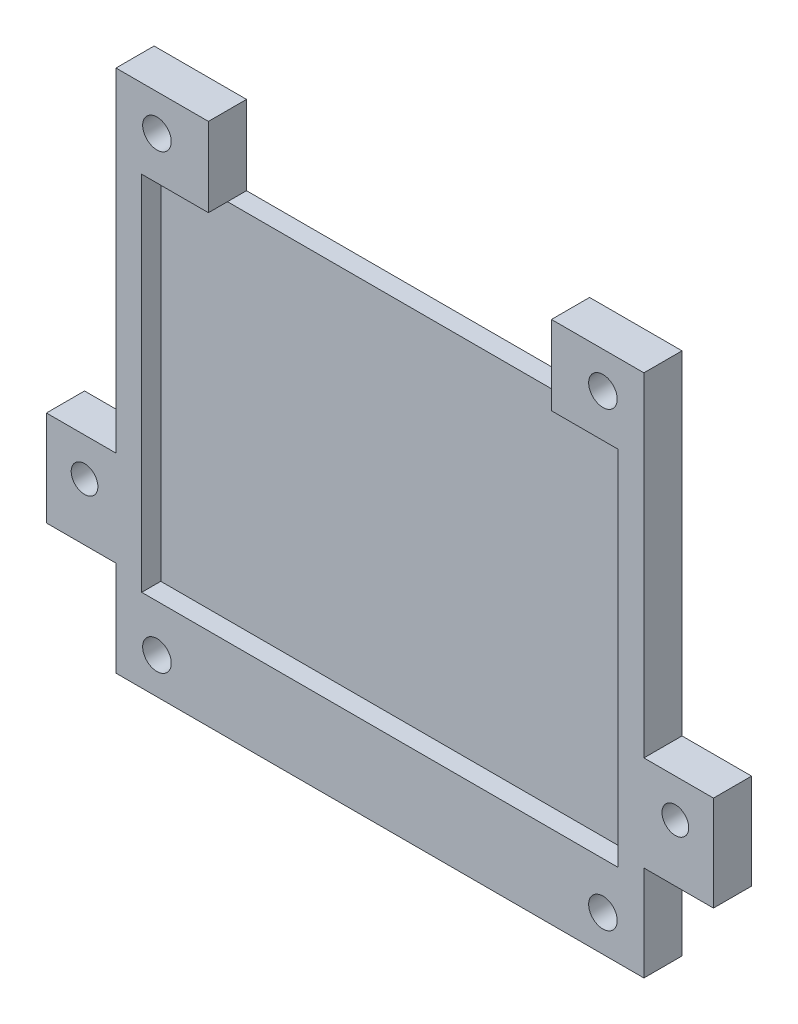
ISO-10303-21;
HEADER;
FILE_DESCRIPTION(('STEP AP214'),'2;1');
FILE_NAME('part.step','',(''),(''),'','','');
FILE_SCHEMA(('AUTOMOTIVE_DESIGN { 1 0 10303 214 1 1 1 1 }'));
ENDSEC;
DATA;
#1=APPLICATION_CONTEXT('core data for automotive mechanical design processes');
#2=APPLICATION_PROTOCOL_DEFINITION('international standard','automotive_design',2000,#1);
#3=PRODUCT_CONTEXT('',#1,'mechanical');
#4=PRODUCT('Part','Part','',(#3));
#5=PRODUCT_RELATED_PRODUCT_CATEGORY('part','',(#4));
#6=PRODUCT_DEFINITION_FORMATION('','',#4);
#7=PRODUCT_DEFINITION_CONTEXT('part definition',#1,'design');
#8=PRODUCT_DEFINITION('design','',#6,#7);
#9=PRODUCT_DEFINITION_SHAPE('','',#8);
#10=(LENGTH_UNIT() NAMED_UNIT(*) SI_UNIT(.MILLI.,.METRE.));
#11=(NAMED_UNIT(*) PLANE_ANGLE_UNIT() SI_UNIT($,.RADIAN.));
#12=(NAMED_UNIT(*) SI_UNIT($,.STERADIAN.) SOLID_ANGLE_UNIT());
#13=UNCERTAINTY_MEASURE_WITH_UNIT(LENGTH_MEASURE(1.E-05),#10,'distance_accuracy_value','');
#14=(GEOMETRIC_REPRESENTATION_CONTEXT(3) GLOBAL_UNCERTAINTY_ASSIGNED_CONTEXT((#13)) GLOBAL_UNIT_ASSIGNED_CONTEXT((#10,
#11,#12)) REPRESENTATION_CONTEXT('',''));
#15=CARTESIAN_POINT('',(0.,0.,0.));
#16=DIRECTION('',(0.,0.,1.));
#17=DIRECTION('',(1.,0.,0.));
#18=AXIS2_PLACEMENT_3D('',#15,#16,#17);
#19=CARTESIAN_POINT('',(13.85,13.75,2.));
#20=DIRECTION('',(1.,0.,0.));
#21=DIRECTION('',(0.,0.,-1.));
#22=AXIS2_PLACEMENT_3D('',#19,#20,#21);
#23=PLANE('',#22);
#24=DIRECTION('',(0.,-1.,0.));
#25=VECTOR('',#24,1.);
#26=CARTESIAN_POINT('',(13.85,13.75,2.));
#27=LINE('',#26,#25);
#28=CARTESIAN_POINT('',(13.85,13.75,2.));
#29=VERTEX_POINT('',#28);
#30=CARTESIAN_POINT('',(13.85,-3.74999999999989,2.));
#31=VERTEX_POINT('',#30);
#32=EDGE_CURVE('E84',#29,#31,#27,.T.);
#33=ORIENTED_EDGE('',*,*,#32,.T.);
#34=DIRECTION('',(0.,0.,-1.));
#35=VECTOR('',#34,1.);
#36=CARTESIAN_POINT('',(13.85,-3.74999999999989,2.));
#37=LINE('',#36,#35);
#38=CARTESIAN_POINT('',(13.85,-3.74999999999989,0.));
#39=VERTEX_POINT('',#38);
#40=EDGE_CURVE('E236',#31,#39,#37,.T.);
#41=ORIENTED_EDGE('',*,*,#40,.T.);
#42=DIRECTION('',(0.,-1.,0.));
#43=VECTOR('',#42,1.);
#44=CARTESIAN_POINT('',(13.85,13.75,0.));
#45=LINE('',#44,#43);
#46=CARTESIAN_POINT('',(13.85,13.75,0.));
#47=VERTEX_POINT('',#46);
#48=EDGE_CURVE('E393',#47,#39,#45,.T.);
#49=ORIENTED_EDGE('',*,*,#48,.F.);
#50=DIRECTION('',(0.,0.,-1.));
#51=VECTOR('',#50,1.);
#52=CARTESIAN_POINT('',(13.85,13.75,2.));
#53=LINE('',#52,#51);
#54=EDGE_CURVE('E401',#29,#47,#53,.T.);
#55=ORIENTED_EDGE('',*,*,#54,.F.);
#56=EDGE_LOOP('',(#33,#41,#49,#55));
#57=FACE_BOUND('',#56,.T.);
#58=ADVANCED_FACE('F69',(#57),#23,.T.);
#59=CARTESIAN_POINT('',(-13.85,13.75,2.));
#60=DIRECTION('',(1.,0.,0.));
#61=DIRECTION('',(0.,0.,-1.));
#62=AXIS2_PLACEMENT_3D('',#59,#60,#61);
#63=PLANE('',#62);
#64=DIRECTION('',(0.,0.,-1.));
#65=VECTOR('',#64,1.);
#66=CARTESIAN_POINT('',(-13.85,-3.75,2.));
#67=LINE('',#66,#65);
#68=CARTESIAN_POINT('',(-13.85,-3.75,2.));
#69=VERTEX_POINT('',#68);
#70=CARTESIAN_POINT('',(-13.85,-3.75,0.));
#71=VERTEX_POINT('',#70);
#72=EDGE_CURVE('E280',#69,#71,#67,.T.);
#73=ORIENTED_EDGE('',*,*,#72,.F.);
#74=DIRECTION('',(0.,-1.,0.));
#75=VECTOR('',#74,1.);
#76=CARTESIAN_POINT('',(-13.85,13.75,2.));
#77=LINE('',#76,#75);
#78=CARTESIAN_POINT('',(-13.85,13.75,2.));
#79=VERTEX_POINT('',#78);
#80=EDGE_CURVE('E373',#79,#69,#77,.T.);
#81=ORIENTED_EDGE('',*,*,#80,.F.);
#82=DIRECTION('',(0.,0.,-1.));
#83=VECTOR('',#82,1.);
#84=CARTESIAN_POINT('',(-13.85,13.75,2.));
#85=LINE('',#84,#83);
#86=CARTESIAN_POINT('',(-13.85,13.75,0.));
#87=VERTEX_POINT('',#86);
#88=EDGE_CURVE('E386',#79,#87,#85,.T.);
#89=ORIENTED_EDGE('',*,*,#88,.T.);
#90=DIRECTION('',(0.,-1.,0.));
#91=VECTOR('',#90,1.);
#92=CARTESIAN_POINT('',(-13.85,13.75,0.));
#93=LINE('',#92,#91);
#94=EDGE_CURVE('E387',#87,#71,#93,.T.);
#95=ORIENTED_EDGE('',*,*,#94,.T.);
#96=EDGE_LOOP('',(#73,#81,#89,#95));
#97=FACE_BOUND('',#96,.T.);
#98=ADVANCED_FACE('F430',(#97),#63,.F.);
#99=CARTESIAN_POINT('',(0.,0.,2.));
#100=DIRECTION('',(0.,0.,1.));
#101=DIRECTION('',(1.,0.,0.));
#102=AXIS2_PLACEMENT_3D('',#99,#100,#101);
#103=PLANE('',#102);
#104=CARTESIAN_POINT('',(13.85,-8.75,2.));
#105=VERTEX_POINT('',#104);
#106=CARTESIAN_POINT('',(13.85,-13.75,2.));
#107=VERTEX_POINT('',#106);
#108=EDGE_CURVE('E380',#105,#107,#27,.T.);
#109=ORIENTED_EDGE('',*,*,#108,.F.);
#110=DIRECTION('',(-1.,0.,0.));
#111=VECTOR('',#110,1.);
#112=CARTESIAN_POINT('',(0.,-8.75,2.));
#113=LINE('',#112,#111);
#114=CARTESIAN_POINT('',(17.5,-8.75,2.));
#115=VERTEX_POINT('',#114);
#116=EDGE_CURVE('E221',#115,#105,#113,.T.);
#117=ORIENTED_EDGE('',*,*,#116,.F.);
#118=DIRECTION('',(0.,1.,0.));
#119=VECTOR('',#118,1.);
#120=CARTESIAN_POINT('',(17.5,0.,2.));
#121=LINE('',#120,#119);
#122=CARTESIAN_POINT('',(17.5,-3.74999999999989,2.));
#123=VERTEX_POINT('',#122);
#124=EDGE_CURVE('E214',#115,#123,#121,.T.);
#125=ORIENTED_EDGE('',*,*,#124,.T.);
#126=DIRECTION('',(-1.,0.,0.));
#127=VECTOR('',#126,1.);
#128=CARTESIAN_POINT('',(0.,-3.74999999999989,2.));
#129=LINE('',#128,#127);
#130=EDGE_CURVE('E219',#123,#31,#129,.T.);
#131=ORIENTED_EDGE('',*,*,#130,.T.);
#132=ORIENTED_EDGE('',*,*,#32,.F.);
#133=DIRECTION('',(1.,0.,0.));
#134=VECTOR('',#133,1.);
#135=CARTESIAN_POINT('',(-13.85,13.75,2.));
#136=LINE('',#135,#134);
#137=CARTESIAN_POINT('',(9.,13.75,2.));
#138=VERTEX_POINT('',#137);
#139=EDGE_CURVE('E382',#138,#29,#136,.T.);
#140=ORIENTED_EDGE('',*,*,#139,.F.);
#141=DIRECTION('',(0.,1.,0.));
#142=VECTOR('',#141,1.);
#143=CARTESIAN_POINT('',(9.,9.60000000000002,2.));
#144=LINE('',#143,#142);
#145=CARTESIAN_POINT('',(9.,9.60000000000002,2.));
#146=VERTEX_POINT('',#145);
#147=EDGE_CURVE('E341',#146,#138,#144,.T.);
#148=ORIENTED_EDGE('',*,*,#147,.F.);
#149=DIRECTION('',(1.,0.,0.));
#150=VECTOR('',#149,1.);
#151=CARTESIAN_POINT('',(-12.5,9.60000000000002,2.));
#152=LINE('',#151,#150);
#153=CARTESIAN_POINT('',(12.5,9.60000000000002,2.));
#154=VERTEX_POINT('',#153);
#155=EDGE_CURVE('E308',#146,#154,#152,.T.);
#156=ORIENTED_EDGE('',*,*,#155,.T.);
#157=DIRECTION('',(0.,-1.,0.));
#158=VECTOR('',#157,1.);
#159=CARTESIAN_POINT('',(12.5,9.60000000000002,2.));
#160=LINE('',#159,#158);
#161=CARTESIAN_POINT('',(12.5,-9.39999999999998,2.));
#162=VERTEX_POINT('',#161);
#163=EDGE_CURVE('E306',#154,#162,#160,.T.);
#164=ORIENTED_EDGE('',*,*,#163,.T.);
#165=DIRECTION('',(1.,0.,0.));
#166=VECTOR('',#165,1.);
#167=CARTESIAN_POINT('',(-12.5,-9.39999999999998,2.));
#168=LINE('',#167,#166);
#169=CARTESIAN_POINT('',(-12.5,-9.39999999999998,2.));
#170=VERTEX_POINT('',#169);
#171=EDGE_CURVE('E303',#170,#162,#168,.T.);
#172=ORIENTED_EDGE('',*,*,#171,.F.);
#173=DIRECTION('',(0.,-1.,0.));
#174=VECTOR('',#173,1.);
#175=CARTESIAN_POINT('',(-12.5,9.60000000000002,2.));
#176=LINE('',#175,#174);
#177=CARTESIAN_POINT('',(-12.5,9.60000000000002,2.));
#178=VERTEX_POINT('',#177);
#179=EDGE_CURVE('E287',#178,#170,#176,.T.);
#180=ORIENTED_EDGE('',*,*,#179,.F.);
#181=CARTESIAN_POINT('',(-9.,9.60000000000002,2.));
#182=VERTEX_POINT('',#181);
#183=EDGE_CURVE('E291',#178,#182,#152,.T.);
#184=ORIENTED_EDGE('',*,*,#183,.T.);
#185=DIRECTION('',(0.,1.,0.));
#186=VECTOR('',#185,1.);
#187=CARTESIAN_POINT('',(-9.,9.60000000000002,2.));
#188=LINE('',#187,#186);
#189=CARTESIAN_POINT('',(-9.,13.75,2.));
#190=VERTEX_POINT('',#189);
#191=EDGE_CURVE('E338',#182,#190,#188,.T.);
#192=ORIENTED_EDGE('',*,*,#191,.T.);
#193=EDGE_CURVE('E383',#79,#190,#136,.T.);
#194=ORIENTED_EDGE('',*,*,#193,.F.);
#195=ORIENTED_EDGE('',*,*,#80,.T.);
#196=DIRECTION('',(-1.,0.,0.));
#197=VECTOR('',#196,1.);
#198=CARTESIAN_POINT('',(0.,-3.75,2.));
#199=LINE('',#198,#197);
#200=CARTESIAN_POINT('',(-17.4999999999999,-3.75,2.));
#201=VERTEX_POINT('',#200);
#202=EDGE_CURVE('E262',#69,#201,#199,.T.);
#203=ORIENTED_EDGE('',*,*,#202,.T.);
#204=DIRECTION('',(0.,1.,0.));
#205=VECTOR('',#204,1.);
#206=CARTESIAN_POINT('',(-17.4999999999999,0.,2.));
#207=LINE('',#206,#205);
#208=CARTESIAN_POINT('',(-17.4999999999999,-8.75,2.));
#209=VERTEX_POINT('',#208);
#210=EDGE_CURVE('E259',#209,#201,#207,.T.);
#211=ORIENTED_EDGE('',*,*,#210,.F.);
#212=DIRECTION('',(-1.,0.,0.));
#213=VECTOR('',#212,1.);
#214=CARTESIAN_POINT('',(0.,-8.75,2.));
#215=LINE('',#214,#213);
#216=CARTESIAN_POINT('',(-13.85,-8.74999999999999,2.));
#217=VERTEX_POINT('',#216);
#218=EDGE_CURVE('E257',#217,#209,#215,.T.);
#219=ORIENTED_EDGE('',*,*,#218,.F.);
#220=CARTESIAN_POINT('',(-13.85,-13.75,2.));
#221=VERTEX_POINT('',#220);
#222=EDGE_CURVE('E377',#217,#221,#77,.T.);
#223=ORIENTED_EDGE('',*,*,#222,.T.);
#224=DIRECTION('',(1.,0.,0.));
#225=VECTOR('',#224,1.);
#226=CARTESIAN_POINT('',(-13.85,-13.75,2.));
#227=LINE('',#226,#225);
#228=EDGE_CURVE('E376',#221,#107,#227,.T.);
#229=ORIENTED_EDGE('',*,*,#228,.T.);
#230=EDGE_LOOP('',(#109,#117,#125,#131,#132,#140,#148,#156,#164,#172,#180,#184,#192,#194,#195,
#203,#211,#219,#223,#229));
#231=FACE_BOUND('',#230,.T.);
#232=CARTESIAN_POINT('',(-11.7,-11.85,2.));
#233=DIRECTION('',(0.,0.,1.));
#234=DIRECTION('',(1.,0.,0.));
#235=AXIS2_PLACEMENT_3D('',#232,#233,#234);
#236=CIRCLE('',#235,0.75);
#237=CARTESIAN_POINT('',(-10.95,-11.85,2.));
#238=VERTEX_POINT('',#237);
#239=EDGE_CURVE('E362',#238,#238,#236,.T.);
#240=ORIENTED_EDGE('',*,*,#239,.F.);
#241=EDGE_LOOP('',(#240));
#242=FACE_BOUND('',#241,.T.);
#243=CARTESIAN_POINT('',(11.7,-11.85,2.));
#244=DIRECTION('',(0.,0.,1.));
#245=DIRECTION('',(1.,0.,0.));
#246=AXIS2_PLACEMENT_3D('',#243,#244,#245);
#247=CIRCLE('',#246,0.75);
#248=CARTESIAN_POINT('',(12.45,-11.85,2.));
#249=VERTEX_POINT('',#248);
#250=EDGE_CURVE('E356',#249,#249,#247,.T.);
#251=ORIENTED_EDGE('',*,*,#250,.F.);
#252=EDGE_LOOP('',(#251));
#253=FACE_BOUND('',#252,.T.);
#254=CARTESIAN_POINT('',(-11.7,11.85,2.));
#255=DIRECTION('',(0.,0.,1.));
#256=DIRECTION('',(1.,0.,0.));
#257=AXIS2_PLACEMENT_3D('',#254,#255,#256);
#258=CIRCLE('',#257,0.75);
#259=CARTESIAN_POINT('',(-10.95,11.85,2.));
#260=VERTEX_POINT('',#259);
#261=EDGE_CURVE('E344',#260,#260,#258,.T.);
#262=ORIENTED_EDGE('',*,*,#261,.F.);
#263=EDGE_LOOP('',(#262));
#264=FACE_BOUND('',#263,.T.);
#265=CARTESIAN_POINT('',(-15.5,-5.74999999999997,2.));
#266=DIRECTION('',(0.,0.,1.));
#267=DIRECTION('',(1.,0.,0.));
#268=AXIS2_PLACEMENT_3D('',#265,#266,#267);
#269=CIRCLE('',#268,0.7);
#270=CARTESIAN_POINT('',(-14.8,-5.74999999999997,2.));
#271=VERTEX_POINT('',#270);
#272=EDGE_CURVE('E256',#271,#271,#269,.T.);
#273=ORIENTED_EDGE('',*,*,#272,.F.);
#274=EDGE_LOOP('',(#273));
#275=FACE_BOUND('',#274,.T.);
#276=CARTESIAN_POINT('',(15.5,-5.74999999999998,2.));
#277=DIRECTION('',(0.,0.,1.));
#278=DIRECTION('',(1.,0.,0.));
#279=AXIS2_PLACEMENT_3D('',#276,#277,#278);
#280=CIRCLE('',#279,0.7);
#281=CARTESIAN_POINT('',(16.2,-5.74999999999998,2.));
#282=VERTEX_POINT('',#281);
#283=EDGE_CURVE('E237',#282,#282,#280,.T.);
#284=ORIENTED_EDGE('',*,*,#283,.F.);
#285=EDGE_LOOP('',(#284));
#286=FACE_BOUND('',#285,.T.);
#287=CARTESIAN_POINT('',(11.7,11.85,2.));
#288=DIRECTION('',(0.,0.,1.));
#289=DIRECTION('',(1.,0.,0.));
#290=AXIS2_PLACEMENT_3D('',#287,#288,#289);
#291=CIRCLE('',#290,0.75);
#292=CARTESIAN_POINT('',(12.45,11.85,2.));
#293=VERTEX_POINT('',#292);
#294=EDGE_CURVE('E337',#293,#293,#291,.T.);
#295=ORIENTED_EDGE('',*,*,#294,.F.);
#296=EDGE_LOOP('',(#295));
#297=FACE_BOUND('',#296,.T.);
#298=ADVANCED_FACE('F216',(#231,#242,#253,#264,#275,#286,#297),#103,.T.);
#299=CARTESIAN_POINT('',(-9.,9.60000000000002,0.));
#300=DIRECTION('',(0.,-1.,0.));
#301=DIRECTION('',(0.,0.,-1.));
#302=AXIS2_PLACEMENT_3D('',#299,#300,#301);
#303=PLANE('',#302);
#304=DIRECTION('',(1.,0.,0.));
#305=VECTOR('',#304,1.);
#306=CARTESIAN_POINT('',(-12.5,9.60000000000002,1.));
#307=LINE('',#306,#305);
#308=CARTESIAN_POINT('',(-9.,9.60000000000002,1.));
#309=VERTEX_POINT('',#308);
#310=CARTESIAN_POINT('',(9.,9.60000000000002,1.));
#311=VERTEX_POINT('',#310);
#312=EDGE_CURVE('E301',#309,#311,#307,.T.);
#313=ORIENTED_EDGE('',*,*,#312,.T.);
#314=DIRECTION('',(0.,0.,1.));
#315=VECTOR('',#314,1.);
#316=CARTESIAN_POINT('',(9.,9.60000000000002,0.));
#317=LINE('',#316,#315);
#318=CARTESIAN_POINT('',(9.,9.60000000000002,0.));
#319=VERTEX_POINT('',#318);
#320=EDGE_CURVE('E324',#319,#311,#317,.T.);
#321=ORIENTED_EDGE('',*,*,#320,.F.);
#322=DIRECTION('',(1.,0.,0.));
#323=VECTOR('',#322,1.);
#324=CARTESIAN_POINT('',(-9.,9.60000000000002,0.));
#325=LINE('',#324,#323);
#326=CARTESIAN_POINT('',(-9.,9.60000000000002,0.));
#327=VERTEX_POINT('',#326);
#328=EDGE_CURVE('E342',#327,#319,#325,.T.);
#329=ORIENTED_EDGE('',*,*,#328,.F.);
#330=DIRECTION('',(0.,0.,1.));
#331=VECTOR('',#330,1.);
#332=CARTESIAN_POINT('',(-9.,9.60000000000002,0.));
#333=LINE('',#332,#331);
#334=EDGE_CURVE('E334',#327,#309,#333,.T.);
#335=ORIENTED_EDGE('',*,*,#334,.T.);
#336=EDGE_LOOP('',(#313,#321,#329,#335));
#337=FACE_BOUND('',#336,.T.);
#338=ADVANCED_FACE('F481',(#337),#303,.F.);
#339=CARTESIAN_POINT('',(-13.85,13.75,2.));
#340=DIRECTION('',(0.,1.,0.));
#341=DIRECTION('',(0.,0.,1.));
#342=AXIS2_PLACEMENT_3D('',#339,#340,#341);
#343=PLANE('',#342);
#344=ORIENTED_EDGE('',*,*,#193,.T.);
#345=DIRECTION('',(0.,0.,1.));
#346=VECTOR('',#345,1.);
#347=CARTESIAN_POINT('',(-9.,13.75,0.));
#348=LINE('',#347,#346);
#349=CARTESIAN_POINT('',(-9.,13.75,0.));
#350=VERTEX_POINT('',#349);
#351=EDGE_CURVE('E332',#350,#190,#348,.T.);
#352=ORIENTED_EDGE('',*,*,#351,.F.);
#353=DIRECTION('',(1.,0.,0.));
#354=VECTOR('',#353,1.);
#355=CARTESIAN_POINT('',(-13.85,13.75,0.));
#356=LINE('',#355,#354);
#357=EDGE_CURVE('E397',#87,#350,#356,.T.);
#358=ORIENTED_EDGE('',*,*,#357,.F.);
#359=ORIENTED_EDGE('',*,*,#88,.F.);
#360=EDGE_LOOP('',(#344,#352,#358,#359));
#361=FACE_BOUND('',#360,.T.);
#362=ADVANCED_FACE('F445',(#361),#343,.T.);
#363=CARTESIAN_POINT('',(0.,0.,0.));
#364=DIRECTION('',(0.,0.,1.));
#365=DIRECTION('',(1.,0.,0.));
#366=AXIS2_PLACEMENT_3D('',#363,#364,#365);
#367=PLANE('',#366);
#368=ORIENTED_EDGE('',*,*,#48,.T.);
#369=DIRECTION('',(-1.,0.,0.));
#370=VECTOR('',#369,1.);
#371=CARTESIAN_POINT('',(0.,-3.74999999999989,0.));
#372=LINE('',#371,#370);
#373=CARTESIAN_POINT('',(17.5,-3.74999999999989,0.));
#374=VERTEX_POINT('',#373);
#375=EDGE_CURVE('E249',#374,#39,#372,.T.);
#376=ORIENTED_EDGE('',*,*,#375,.F.);
#377=DIRECTION('',(0.,1.,0.));
#378=VECTOR('',#377,1.);
#379=CARTESIAN_POINT('',(17.5,0.,0.));
#380=LINE('',#379,#378);
#381=CARTESIAN_POINT('',(17.5,-8.75,0.));
#382=VERTEX_POINT('',#381);
#383=EDGE_CURVE('E229',#382,#374,#380,.T.);
#384=ORIENTED_EDGE('',*,*,#383,.F.);
#385=DIRECTION('',(-1.,0.,0.));
#386=VECTOR('',#385,1.);
#387=CARTESIAN_POINT('',(0.,-8.75,0.));
#388=LINE('',#387,#386);
#389=CARTESIAN_POINT('',(13.85,-8.74999999999999,0.));
#390=VERTEX_POINT('',#389);
#391=EDGE_CURVE('E246',#382,#390,#388,.T.);
#392=ORIENTED_EDGE('',*,*,#391,.T.);
#393=CARTESIAN_POINT('',(13.85,-13.75,0.));
#394=VERTEX_POINT('',#393);
#395=EDGE_CURVE('E92',#390,#394,#45,.T.);
#396=ORIENTED_EDGE('',*,*,#395,.T.);
#397=DIRECTION('',(1.,0.,0.));
#398=VECTOR('',#397,1.);
#399=CARTESIAN_POINT('',(-13.85,-13.75,0.));
#400=LINE('',#399,#398);
#401=CARTESIAN_POINT('',(-13.85,-13.75,0.));
#402=VERTEX_POINT('',#401);
#403=EDGE_CURVE('E390',#402,#394,#400,.T.);
#404=ORIENTED_EDGE('',*,*,#403,.F.);
#405=CARTESIAN_POINT('',(-13.85,-8.75,0.));
#406=VERTEX_POINT('',#405);
#407=EDGE_CURVE('E370',#406,#402,#93,.T.);
#408=ORIENTED_EDGE('',*,*,#407,.F.);
#409=DIRECTION('',(-1.,0.,0.));
#410=VECTOR('',#409,1.);
#411=CARTESIAN_POINT('',(0.,-8.75,0.));
#412=LINE('',#411,#410);
#413=CARTESIAN_POINT('',(-17.4999999999999,-8.75,0.));
#414=VERTEX_POINT('',#413);
#415=EDGE_CURVE('E272',#406,#414,#412,.T.);
#416=ORIENTED_EDGE('',*,*,#415,.T.);
#417=DIRECTION('',(0.,1.,0.));
#418=VECTOR('',#417,1.);
#419=CARTESIAN_POINT('',(-17.4999999999999,0.,0.));
#420=LINE('',#419,#418);
#421=CARTESIAN_POINT('',(-17.4999999999999,-3.75,0.));
#422=VERTEX_POINT('',#421);
#423=EDGE_CURVE('E269',#414,#422,#420,.T.);
#424=ORIENTED_EDGE('',*,*,#423,.T.);
#425=DIRECTION('',(-1.,0.,0.));
#426=VECTOR('',#425,1.);
#427=CARTESIAN_POINT('',(0.,-3.75,0.));
#428=LINE('',#427,#426);
#429=EDGE_CURVE('E267',#71,#422,#428,.T.);
#430=ORIENTED_EDGE('',*,*,#429,.F.);
#431=ORIENTED_EDGE('',*,*,#94,.F.);
#432=ORIENTED_EDGE('',*,*,#357,.T.);
#433=DIRECTION('',(0.,1.,0.));
#434=VECTOR('',#433,1.);
#435=CARTESIAN_POINT('',(-9.,9.60000000000002,0.));
#436=LINE('',#435,#434);
#437=EDGE_CURVE('E327',#327,#350,#436,.T.);
#438=ORIENTED_EDGE('',*,*,#437,.F.);
#439=ORIENTED_EDGE('',*,*,#328,.T.);
#440=DIRECTION('',(0.,1.,0.));
#441=VECTOR('',#440,1.);
#442=CARTESIAN_POINT('',(9.,9.60000000000002,0.));
#443=LINE('',#442,#441);
#444=CARTESIAN_POINT('',(9.,13.75,0.));
#445=VERTEX_POINT('',#444);
#446=EDGE_CURVE('E346',#319,#445,#443,.T.);
#447=ORIENTED_EDGE('',*,*,#446,.T.);
#448=EDGE_CURVE('E396',#445,#47,#356,.T.);
#449=ORIENTED_EDGE('',*,*,#448,.T.);
#450=EDGE_LOOP('',(#368,#376,#384,#392,#396,#404,#408,#416,#424,#430,#431,#432,#438,#439,#447,#449));
#451=FACE_BOUND('',#450,.T.);
#452=CARTESIAN_POINT('',(15.5,-5.74999999999998,0.));
#453=DIRECTION('',(0.,0.,1.));
#454=DIRECTION('',(1.,0.,0.));
#455=AXIS2_PLACEMENT_3D('',#452,#453,#454);
#456=CIRCLE('',#455,0.7);
#457=CARTESIAN_POINT('',(16.2,-5.74999999999998,0.));
#458=VERTEX_POINT('',#457);
#459=EDGE_CURVE('E243',#458,#458,#456,.T.);
#460=ORIENTED_EDGE('',*,*,#459,.T.);
#461=EDGE_LOOP('',(#460));
#462=FACE_BOUND('',#461,.T.);
#463=CARTESIAN_POINT('',(-15.5,-5.74999999999997,0.));
#464=DIRECTION('',(0.,0.,1.));
#465=DIRECTION('',(1.,0.,0.));
#466=AXIS2_PLACEMENT_3D('',#463,#464,#465);
#467=CIRCLE('',#466,0.7);
#468=CARTESIAN_POINT('',(-14.8,-5.74999999999997,0.));
#469=VERTEX_POINT('',#468);
#470=EDGE_CURVE('E264',#469,#469,#467,.T.);
#471=ORIENTED_EDGE('',*,*,#470,.T.);
#472=EDGE_LOOP('',(#471));
#473=FACE_BOUND('',#472,.T.);
#474=CARTESIAN_POINT('',(-11.7,11.85,0.));
#475=DIRECTION('',(0.,0.,1.));
#476=DIRECTION('',(1.,0.,0.));
#477=AXIS2_PLACEMENT_3D('',#474,#475,#476);
#478=CIRCLE('',#477,0.75);
#479=CARTESIAN_POINT('',(-10.95,11.85,0.));
#480=VERTEX_POINT('',#479);
#481=EDGE_CURVE('E367',#480,#480,#478,.T.);
#482=ORIENTED_EDGE('',*,*,#481,.T.);
#483=EDGE_LOOP('',(#482));
#484=FACE_BOUND('',#483,.T.);
#485=CARTESIAN_POINT('',(11.7,11.85,0.));
#486=DIRECTION('',(0.,0.,1.));
#487=DIRECTION('',(1.,0.,0.));
#488=AXIS2_PLACEMENT_3D('',#485,#486,#487);
#489=CIRCLE('',#488,0.75);
#490=CARTESIAN_POINT('',(12.45,11.85,0.));
#491=VERTEX_POINT('',#490);
#492=EDGE_CURVE('E353',#491,#491,#489,.T.);
#493=ORIENTED_EDGE('',*,*,#492,.T.);
#494=EDGE_LOOP('',(#493));
#495=FACE_BOUND('',#494,.T.);
#496=CARTESIAN_POINT('',(11.7,-11.85,0.));
#497=DIRECTION('',(0.,0.,1.));
#498=DIRECTION('',(1.,0.,0.));
#499=AXIS2_PLACEMENT_3D('',#496,#497,#498);
#500=CIRCLE('',#499,0.75);
#501=CARTESIAN_POINT('',(12.45,-11.85,0.));
#502=VERTEX_POINT('',#501);
#503=EDGE_CURVE('E359',#502,#502,#500,.T.);
#504=ORIENTED_EDGE('',*,*,#503,.T.);
#505=EDGE_LOOP('',(#504));
#506=FACE_BOUND('',#505,.T.);
#507=CARTESIAN_POINT('',(-11.7,-11.85,0.));
#508=DIRECTION('',(0.,0.,1.));
#509=DIRECTION('',(1.,0.,0.));
#510=AXIS2_PLACEMENT_3D('',#507,#508,#509);
#511=CIRCLE('',#510,0.75);
#512=CARTESIAN_POINT('',(-10.95,-11.85,0.));
#513=VERTEX_POINT('',#512);
#514=EDGE_CURVE('E323',#513,#513,#511,.T.);
#515=ORIENTED_EDGE('',*,*,#514,.T.);
#516=EDGE_LOOP('',(#515));
#517=FACE_BOUND('',#516,.T.);
#518=ADVANCED_FACE('F412',(#451,#462,#473,#484,#495,#506,#517),#367,.F.);
#519=ORIENTED_EDGE('',*,*,#222,.F.);
#520=DIRECTION('',(0.,0.,-1.));
#521=VECTOR('',#520,1.);
#522=CARTESIAN_POINT('',(-13.85,-8.75,2.));
#523=LINE('',#522,#521);
#524=EDGE_CURVE('E284',#217,#406,#523,.T.);
#525=ORIENTED_EDGE('',*,*,#524,.T.);
#526=ORIENTED_EDGE('',*,*,#407,.T.);
#527=DIRECTION('',(0.,0.,-1.));
#528=VECTOR('',#527,1.);
#529=CARTESIAN_POINT('',(-13.85,-13.75,2.));
#530=LINE('',#529,#528);
#531=EDGE_CURVE('E12',#221,#402,#530,.T.);
#532=ORIENTED_EDGE('',*,*,#531,.F.);
#533=EDGE_LOOP('',(#519,#525,#526,#532));
#534=FACE_BOUND('',#533,.T.);
#535=ADVANCED_FACE('F71',(#534),#63,.F.);
#536=CARTESIAN_POINT('',(-13.85,-13.75,2.));
#537=DIRECTION('',(0.,1.,0.));
#538=DIRECTION('',(-1.,0.,0.));
#539=AXIS2_PLACEMENT_3D('',#536,#537,#538);
#540=PLANE('',#539);
#541=ORIENTED_EDGE('',*,*,#403,.T.);
#542=DIRECTION('',(0.,0.,-1.));
#543=VECTOR('',#542,1.);
#544=CARTESIAN_POINT('',(13.85,-13.75,2.));
#545=LINE('',#544,#543);
#546=EDGE_CURVE('E77',#107,#394,#545,.T.);
#547=ORIENTED_EDGE('',*,*,#546,.F.);
#548=ORIENTED_EDGE('',*,*,#228,.F.);
#549=ORIENTED_EDGE('',*,*,#531,.T.);
#550=EDGE_LOOP('',(#541,#547,#548,#549));
#551=FACE_BOUND('',#550,.T.);
#552=ADVANCED_FACE('F408',(#551),#540,.F.);
#553=DIRECTION('',(0.,0.,-1.));
#554=VECTOR('',#553,1.);
#555=CARTESIAN_POINT('',(13.85,-8.75,2.));
#556=LINE('',#555,#554);
#557=EDGE_CURVE('E252',#105,#390,#556,.T.);
#558=ORIENTED_EDGE('',*,*,#557,.F.);
#559=ORIENTED_EDGE('',*,*,#108,.T.);
#560=ORIENTED_EDGE('',*,*,#546,.T.);
#561=ORIENTED_EDGE('',*,*,#395,.F.);
#562=EDGE_LOOP('',(#558,#559,#560,#561));
#563=FACE_BOUND('',#562,.T.);
#564=ADVANCED_FACE('F404',(#563),#23,.T.);
#565=DIRECTION('',(0.,0.,1.));
#566=VECTOR('',#565,1.);
#567=CARTESIAN_POINT('',(9.,13.75,0.));
#568=LINE('',#567,#566);
#569=EDGE_CURVE('E329',#445,#138,#568,.T.);
#570=ORIENTED_EDGE('',*,*,#569,.T.);
#571=ORIENTED_EDGE('',*,*,#139,.T.);
#572=ORIENTED_EDGE('',*,*,#54,.T.);
#573=ORIENTED_EDGE('',*,*,#448,.F.);
#574=EDGE_LOOP('',(#570,#571,#572,#573));
#575=FACE_BOUND('',#574,.T.);
#576=ADVANCED_FACE('F438',(#575),#343,.T.);
#577=CARTESIAN_POINT('',(-11.7,11.85,0.));
#578=DIRECTION('',(0.,0.,1.));
#579=DIRECTION('',(1.,0.,0.));
#580=AXIS2_PLACEMENT_3D('',#577,#578,#579);
#581=CYLINDRICAL_SURFACE('',#580,0.75);
#582=ORIENTED_EDGE('',*,*,#481,.F.);
#583=EDGE_LOOP('',(#582));
#584=FACE_BOUND('',#583,.T.);
#585=ORIENTED_EDGE('',*,*,#261,.T.);
#586=EDGE_LOOP('',(#585));
#587=FACE_BOUND('',#586,.T.);
#588=ADVANCED_FACE('F443',(#584,#587),#581,.F.);
#589=CARTESIAN_POINT('',(-9.,9.60000000000002,0.));
#590=DIRECTION('',(1.,0.,0.));
#591=DIRECTION('',(0.,0.,-1.));
#592=AXIS2_PLACEMENT_3D('',#589,#590,#591);
#593=PLANE('',#592);
#594=ORIENTED_EDGE('',*,*,#191,.F.);
#595=DIRECTION('',(0.,0.,-1.));
#596=VECTOR('',#595,1.);
#597=CARTESIAN_POINT('',(-9.,9.60000000000002,0.));
#598=LINE('',#597,#596);
#599=EDGE_CURVE('E313',#182,#309,#598,.T.);
#600=ORIENTED_EDGE('',*,*,#599,.T.);
#601=ORIENTED_EDGE('',*,*,#334,.F.);
#602=ORIENTED_EDGE('',*,*,#437,.T.);
#603=ORIENTED_EDGE('',*,*,#351,.T.);
#604=EDGE_LOOP('',(#594,#600,#601,#602,#603));
#605=FACE_BOUND('',#604,.T.);
#606=ADVANCED_FACE('F478',(#605),#593,.T.);
#607=CARTESIAN_POINT('',(9.,9.60000000000002,0.));
#608=DIRECTION('',(1.,0.,0.));
#609=DIRECTION('',(0.,0.,-1.));
#610=AXIS2_PLACEMENT_3D('',#607,#608,#609);
#611=PLANE('',#610);
#612=ORIENTED_EDGE('',*,*,#147,.T.);
#613=ORIENTED_EDGE('',*,*,#569,.F.);
#614=ORIENTED_EDGE('',*,*,#446,.F.);
#615=ORIENTED_EDGE('',*,*,#320,.T.);
#616=EDGE_CURVE('E328',#311,#146,#317,.T.);
#617=ORIENTED_EDGE('',*,*,#616,.T.);
#618=EDGE_LOOP('',(#612,#613,#614,#615,#617));
#619=FACE_BOUND('',#618,.T.);
#620=ADVANCED_FACE('F485',(#619),#611,.F.);
#621=CARTESIAN_POINT('',(11.7,11.85,0.));
#622=DIRECTION('',(0.,0.,1.));
#623=DIRECTION('',(1.,0.,0.));
#624=AXIS2_PLACEMENT_3D('',#621,#622,#623);
#625=CYLINDRICAL_SURFACE('',#624,0.75);
#626=ORIENTED_EDGE('',*,*,#492,.F.);
#627=EDGE_LOOP('',(#626));
#628=FACE_BOUND('',#627,.T.);
#629=ORIENTED_EDGE('',*,*,#294,.T.);
#630=EDGE_LOOP('',(#629));
#631=FACE_BOUND('',#630,.T.);
#632=ADVANCED_FACE('F535',(#628,#631),#625,.F.);
#633=CARTESIAN_POINT('',(11.7,-11.85,0.));
#634=DIRECTION('',(0.,0.,1.));
#635=DIRECTION('',(1.,0.,0.));
#636=AXIS2_PLACEMENT_3D('',#633,#634,#635);
#637=CYLINDRICAL_SURFACE('',#636,0.75);
#638=ORIENTED_EDGE('',*,*,#503,.F.);
#639=EDGE_LOOP('',(#638));
#640=FACE_BOUND('',#639,.T.);
#641=ORIENTED_EDGE('',*,*,#250,.T.);
#642=EDGE_LOOP('',(#641));
#643=FACE_BOUND('',#642,.T.);
#644=ADVANCED_FACE('F529',(#640,#643),#637,.F.);
#645=CARTESIAN_POINT('',(-11.7,-11.85,0.));
#646=DIRECTION('',(0.,0.,1.));
#647=DIRECTION('',(1.,0.,0.));
#648=AXIS2_PLACEMENT_3D('',#645,#646,#647);
#649=CYLINDRICAL_SURFACE('',#648,0.75);
#650=ORIENTED_EDGE('',*,*,#514,.F.);
#651=EDGE_LOOP('',(#650));
#652=FACE_BOUND('',#651,.T.);
#653=ORIENTED_EDGE('',*,*,#239,.T.);
#654=EDGE_LOOP('',(#653));
#655=FACE_BOUND('',#654,.T.);
#656=ADVANCED_FACE('F525',(#652,#655),#649,.F.);
#657=CARTESIAN_POINT('',(-12.5,9.60000000000002,1.));
#658=DIRECTION('',(0.,-1.,0.));
#659=DIRECTION('',(0.,0.,-1.));
#660=AXIS2_PLACEMENT_3D('',#657,#658,#659);
#661=PLANE('',#660);
#662=ORIENTED_EDGE('',*,*,#616,.F.);
#663=CARTESIAN_POINT('',(12.5,9.60000000000002,1.));
#664=VERTEX_POINT('',#663);
#665=EDGE_CURVE('E296',#311,#664,#307,.T.);
#666=ORIENTED_EDGE('',*,*,#665,.T.);
#667=DIRECTION('',(0.,0.,1.));
#668=VECTOR('',#667,1.);
#669=CARTESIAN_POINT('',(12.5,9.60000000000002,1.));
#670=LINE('',#669,#668);
#671=EDGE_CURVE('E314',#664,#154,#670,.T.);
#672=ORIENTED_EDGE('',*,*,#671,.T.);
#673=ORIENTED_EDGE('',*,*,#155,.F.);
#674=EDGE_LOOP('',(#662,#666,#672,#673));
#675=FACE_BOUND('',#674,.T.);
#676=ADVANCED_FACE('F493',(#675),#661,.T.);
#677=CARTESIAN_POINT('',(-12.5,9.60000000000002,1.));
#678=DIRECTION('',(-1.,0.,0.));
#679=DIRECTION('',(0.,-1.,0.));
#680=AXIS2_PLACEMENT_3D('',#677,#678,#679);
#681=PLANE('',#680);
#682=DIRECTION('',(0.,0.,1.));
#683=VECTOR('',#682,1.);
#684=CARTESIAN_POINT('',(-12.5,-9.39999999999998,1.));
#685=LINE('',#684,#683);
#686=CARTESIAN_POINT('',(-12.5,-9.39999999999998,1.));
#687=VERTEX_POINT('',#686);
#688=EDGE_CURVE('E300',#687,#170,#685,.T.);
#689=ORIENTED_EDGE('',*,*,#688,.F.);
#690=DIRECTION('',(0.,-1.,0.));
#691=VECTOR('',#690,1.);
#692=CARTESIAN_POINT('',(-12.5,9.60000000000002,1.));
#693=LINE('',#692,#691);
#694=CARTESIAN_POINT('',(-12.5,9.60000000000002,1.));
#695=VERTEX_POINT('',#694);
#696=EDGE_CURVE('E288',#695,#687,#693,.T.);
#697=ORIENTED_EDGE('',*,*,#696,.F.);
#698=DIRECTION('',(0.,0.,1.));
#699=VECTOR('',#698,1.);
#700=CARTESIAN_POINT('',(-12.5,9.60000000000002,1.));
#701=LINE('',#700,#699);
#702=EDGE_CURVE('E311',#695,#178,#701,.T.);
#703=ORIENTED_EDGE('',*,*,#702,.T.);
#704=ORIENTED_EDGE('',*,*,#179,.T.);
#705=EDGE_LOOP('',(#689,#697,#703,#704));
#706=FACE_BOUND('',#705,.T.);
#707=ADVANCED_FACE('F511',(#706),#681,.F.);
#708=ORIENTED_EDGE('',*,*,#183,.F.);
#709=ORIENTED_EDGE('',*,*,#702,.F.);
#710=EDGE_CURVE('E297',#695,#309,#307,.T.);
#711=ORIENTED_EDGE('',*,*,#710,.T.);
#712=ORIENTED_EDGE('',*,*,#599,.F.);
#713=EDGE_LOOP('',(#708,#709,#711,#712));
#714=FACE_BOUND('',#713,.T.);
#715=ADVANCED_FACE('F514',(#714),#661,.T.);
#716=CARTESIAN_POINT('',(12.5,9.60000000000002,1.));
#717=DIRECTION('',(-1.,0.,0.));
#718=DIRECTION('',(0.,-1.,0.));
#719=AXIS2_PLACEMENT_3D('',#716,#717,#718);
#720=PLANE('',#719);
#721=DIRECTION('',(0.,0.,1.));
#722=VECTOR('',#721,1.);
#723=CARTESIAN_POINT('',(12.5,-9.39999999999998,1.));
#724=LINE('',#723,#722);
#725=CARTESIAN_POINT('',(12.5,-9.39999999999998,1.));
#726=VERTEX_POINT('',#725);
#727=EDGE_CURVE('E316',#726,#162,#724,.T.);
#728=ORIENTED_EDGE('',*,*,#727,.T.);
#729=ORIENTED_EDGE('',*,*,#163,.F.);
#730=ORIENTED_EDGE('',*,*,#671,.F.);
#731=DIRECTION('',(0.,-1.,0.));
#732=VECTOR('',#731,1.);
#733=CARTESIAN_POINT('',(12.5,9.60000000000002,1.));
#734=LINE('',#733,#732);
#735=EDGE_CURVE('E294',#664,#726,#734,.T.);
#736=ORIENTED_EDGE('',*,*,#735,.T.);
#737=EDGE_LOOP('',(#728,#729,#730,#736));
#738=FACE_BOUND('',#737,.T.);
#739=ADVANCED_FACE('F502',(#738),#720,.T.);
#740=CARTESIAN_POINT('',(-12.5,-9.39999999999998,1.));
#741=DIRECTION('',(0.,-1.,0.));
#742=DIRECTION('',(1.,0.,0.));
#743=AXIS2_PLACEMENT_3D('',#740,#741,#742);
#744=PLANE('',#743);
#745=ORIENTED_EDGE('',*,*,#171,.T.);
#746=ORIENTED_EDGE('',*,*,#727,.F.);
#747=DIRECTION('',(1.,0.,0.));
#748=VECTOR('',#747,1.);
#749=CARTESIAN_POINT('',(-12.5,-9.39999999999998,1.));
#750=LINE('',#749,#748);
#751=EDGE_CURVE('E290',#687,#726,#750,.T.);
#752=ORIENTED_EDGE('',*,*,#751,.F.);
#753=ORIENTED_EDGE('',*,*,#688,.T.);
#754=EDGE_LOOP('',(#745,#746,#752,#753));
#755=FACE_BOUND('',#754,.T.);
#756=ADVANCED_FACE('F505',(#755),#744,.F.);
#757=CARTESIAN_POINT('',(0.,0.,1.));
#758=DIRECTION('',(0.,0.,1.));
#759=DIRECTION('',(1.,0.,0.));
#760=AXIS2_PLACEMENT_3D('',#757,#758,#759);
#761=PLANE('',#760);
#762=ORIENTED_EDGE('',*,*,#696,.T.);
#763=ORIENTED_EDGE('',*,*,#751,.T.);
#764=ORIENTED_EDGE('',*,*,#735,.F.);
#765=ORIENTED_EDGE('',*,*,#665,.F.);
#766=ORIENTED_EDGE('',*,*,#312,.F.);
#767=ORIENTED_EDGE('',*,*,#710,.F.);
#768=EDGE_LOOP('',(#762,#763,#764,#765,#766,#767));
#769=FACE_BOUND('',#768,.T.);
#770=ADVANCED_FACE('F497',(#769),#761,.T.);
#771=CARTESIAN_POINT('',(0.,-8.75,9.07106781186556));
#772=DIRECTION('',(0.,-1.,0.));
#773=DIRECTION('',(1.,0.,0.));
#774=AXIS2_PLACEMENT_3D('',#771,#772,#773);
#775=PLANE('',#774);
#776=ORIENTED_EDGE('',*,*,#524,.F.);
#777=ORIENTED_EDGE('',*,*,#218,.T.);
#778=DIRECTION('',(0.,0.,-1.));
#779=VECTOR('',#778,1.);
#780=CARTESIAN_POINT('',(-17.4999999999999,-8.75,9.07106781186556));
#781=LINE('',#780,#779);
#782=EDGE_CURVE('E274',#209,#414,#781,.T.);
#783=ORIENTED_EDGE('',*,*,#782,.T.);
#784=ORIENTED_EDGE('',*,*,#415,.F.);
#785=EDGE_LOOP('',(#776,#777,#783,#784));
#786=FACE_BOUND('',#785,.T.);
#787=ADVANCED_FACE('F459',(#786),#775,.T.);
#788=CARTESIAN_POINT('',(0.,-3.75,9.07106781186556));
#789=DIRECTION('',(0.,-1.,0.));
#790=DIRECTION('',(1.,0.,0.));
#791=AXIS2_PLACEMENT_3D('',#788,#789,#790);
#792=PLANE('',#791);
#793=ORIENTED_EDGE('',*,*,#202,.F.);
#794=ORIENTED_EDGE('',*,*,#72,.T.);
#795=ORIENTED_EDGE('',*,*,#429,.T.);
#796=DIRECTION('',(0.,0.,-1.));
#797=VECTOR('',#796,1.);
#798=CARTESIAN_POINT('',(-17.4999999999999,-3.75,9.07106781186556));
#799=LINE('',#798,#797);
#800=EDGE_CURVE('E277',#201,#422,#799,.T.);
#801=ORIENTED_EDGE('',*,*,#800,.F.);
#802=EDGE_LOOP('',(#793,#794,#795,#801));
#803=FACE_BOUND('',#802,.T.);
#804=ADVANCED_FACE('F467',(#803),#792,.F.);
#805=CARTESIAN_POINT('',(-17.4999999999999,0.,9.07106781186556));
#806=DIRECTION('',(-1.,0.,0.));
#807=DIRECTION('',(0.,-1.,0.));
#808=AXIS2_PLACEMENT_3D('',#805,#806,#807);
#809=PLANE('',#808);
#810=ORIENTED_EDGE('',*,*,#782,.F.);
#811=ORIENTED_EDGE('',*,*,#210,.T.);
#812=ORIENTED_EDGE('',*,*,#800,.T.);
#813=ORIENTED_EDGE('',*,*,#423,.F.);
#814=EDGE_LOOP('',(#810,#811,#812,#813));
#815=FACE_BOUND('',#814,.T.);
#816=ADVANCED_FACE('F464',(#815),#809,.T.);
#817=CARTESIAN_POINT('',(-15.5,-5.74999999999997,9.07106781186556));
#818=DIRECTION('',(0.,0.,-1.));
#819=DIRECTION('',(-1.,0.,0.));
#820=AXIS2_PLACEMENT_3D('',#817,#818,#819);
#821=CYLINDRICAL_SURFACE('',#820,0.7);
#822=ORIENTED_EDGE('',*,*,#470,.F.);
#823=EDGE_LOOP('',(#822));
#824=FACE_BOUND('',#823,.T.);
#825=ORIENTED_EDGE('',*,*,#272,.T.);
#826=EDGE_LOOP('',(#825));
#827=FACE_BOUND('',#826,.T.);
#828=ADVANCED_FACE('F581',(#824,#827),#821,.F.);
#829=CARTESIAN_POINT('',(0.,-3.74999999999989,9.07106781186556));
#830=DIRECTION('',(0.,-1.,0.));
#831=DIRECTION('',(1.,0.,0.));
#832=AXIS2_PLACEMENT_3D('',#829,#830,#831);
#833=PLANE('',#832);
#834=ORIENTED_EDGE('',*,*,#40,.F.);
#835=ORIENTED_EDGE('',*,*,#130,.F.);
#836=DIRECTION('',(0.,0.,-1.));
#837=VECTOR('',#836,1.);
#838=CARTESIAN_POINT('',(17.5,-3.74999999999989,9.07106781186556));
#839=LINE('',#838,#837);
#840=EDGE_CURVE('E226',#123,#374,#839,.T.);
#841=ORIENTED_EDGE('',*,*,#840,.T.);
#842=ORIENTED_EDGE('',*,*,#375,.T.);
#843=EDGE_LOOP('',(#834,#835,#841,#842));
#844=FACE_BOUND('',#843,.T.);
#845=ADVANCED_FACE('F235',(#844),#833,.F.);
#846=CARTESIAN_POINT('',(17.5,0.,9.07106781186556));
#847=DIRECTION('',(-1.,0.,0.));
#848=DIRECTION('',(0.,-1.,0.));
#849=AXIS2_PLACEMENT_3D('',#846,#847,#848);
#850=PLANE('',#849);
#851=ORIENTED_EDGE('',*,*,#124,.F.);
#852=DIRECTION('',(0.,0.,-1.));
#853=VECTOR('',#852,1.);
#854=CARTESIAN_POINT('',(17.5,-8.75,9.07106781186556));
#855=LINE('',#854,#853);
#856=EDGE_CURVE('E233',#115,#382,#855,.T.);
#857=ORIENTED_EDGE('',*,*,#856,.T.);
#858=ORIENTED_EDGE('',*,*,#383,.T.);
#859=ORIENTED_EDGE('',*,*,#840,.F.);
#860=EDGE_LOOP('',(#851,#857,#858,#859));
#861=FACE_BOUND('',#860,.T.);
#862=ADVANCED_FACE('F227',(#861),#850,.F.);
#863=CARTESIAN_POINT('',(0.,-8.75,9.07106781186556));
#864=DIRECTION('',(0.,-1.,0.));
#865=DIRECTION('',(1.,0.,0.));
#866=AXIS2_PLACEMENT_3D('',#863,#864,#865);
#867=PLANE('',#866);
#868=ORIENTED_EDGE('',*,*,#116,.T.);
#869=ORIENTED_EDGE('',*,*,#557,.T.);
#870=ORIENTED_EDGE('',*,*,#391,.F.);
#871=ORIENTED_EDGE('',*,*,#856,.F.);
#872=EDGE_LOOP('',(#868,#869,#870,#871));
#873=FACE_BOUND('',#872,.T.);
#874=ADVANCED_FACE('F416',(#873),#867,.T.);
#875=CARTESIAN_POINT('',(15.5,-5.74999999999998,9.07106781186556));
#876=DIRECTION('',(0.,0.,-1.));
#877=DIRECTION('',(-1.,0.,0.));
#878=AXIS2_PLACEMENT_3D('',#875,#876,#877);
#879=CYLINDRICAL_SURFACE('',#878,0.7);
#880=ORIENTED_EDGE('',*,*,#459,.F.);
#881=EDGE_LOOP('',(#880));
#882=FACE_BOUND('',#881,.T.);
#883=ORIENTED_EDGE('',*,*,#283,.T.);
#884=EDGE_LOOP('',(#883));
#885=FACE_BOUND('',#884,.T.);
#886=ADVANCED_FACE('F418',(#882,#885),#879,.F.);
#887=CLOSED_SHELL('',(#58,#98,#298,#338,#362,#518,#535,#552,#564,#576,#588,#606,#620,#632,#644,
#656,#676,#707,#715,#739,#756,#770,#787,#804,#816,#828,#845,#862,#874,#886));
#888=MANIFOLD_SOLID_BREP('B2',#887);
#889=ADVANCED_BREP_SHAPE_REPRESENTATION('',(#18,#888),#14);
#890=SHAPE_DEFINITION_REPRESENTATION(#9,#889);
ENDSEC;
END-ISO-10303-21;
